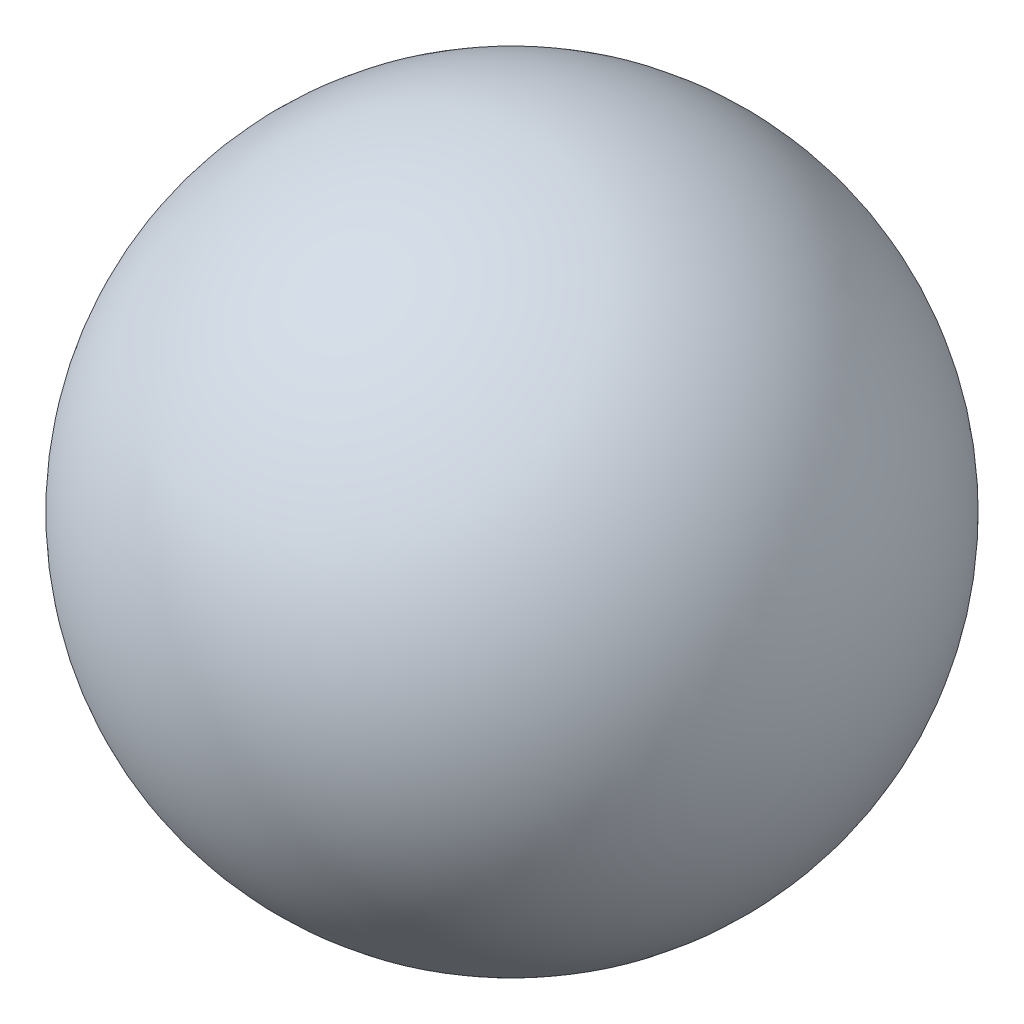
ISO-10303-21;
HEADER;
FILE_DESCRIPTION(('STEP AP214'),'2;1');
FILE_NAME('part.step','',(''),(''),'','','');
FILE_SCHEMA(('AUTOMOTIVE_DESIGN { 1 0 10303 214 1 1 1 1 }'));
ENDSEC;
DATA;
#1=APPLICATION_CONTEXT('core data for automotive mechanical design processes');
#2=APPLICATION_PROTOCOL_DEFINITION('international standard','automotive_design',2000,#1);
#3=PRODUCT_CONTEXT('',#1,'mechanical');
#4=PRODUCT('Part','Part','',(#3));
#5=PRODUCT_RELATED_PRODUCT_CATEGORY('part','',(#4));
#6=PRODUCT_DEFINITION_FORMATION('','',#4);
#7=PRODUCT_DEFINITION_CONTEXT('part definition',#1,'design');
#8=PRODUCT_DEFINITION('design','',#6,#7);
#9=PRODUCT_DEFINITION_SHAPE('','',#8);
#10=(LENGTH_UNIT() NAMED_UNIT(*) SI_UNIT(.MILLI.,.METRE.));
#11=(NAMED_UNIT(*) PLANE_ANGLE_UNIT() SI_UNIT($,.RADIAN.));
#12=(NAMED_UNIT(*) SI_UNIT($,.STERADIAN.) SOLID_ANGLE_UNIT());
#13=UNCERTAINTY_MEASURE_WITH_UNIT(LENGTH_MEASURE(1.E-05),#10,'distance_accuracy_value','');
#14=(GEOMETRIC_REPRESENTATION_CONTEXT(3) GLOBAL_UNCERTAINTY_ASSIGNED_CONTEXT((#13)) GLOBAL_UNIT_ASSIGNED_CONTEXT((#10,
#11,#12)) REPRESENTATION_CONTEXT('',''));
#15=CARTESIAN_POINT('',(0.,0.,0.));
#16=DIRECTION('',(0.,0.,1.));
#17=DIRECTION('',(1.,0.,0.));
#18=AXIS2_PLACEMENT_3D('',#15,#16,#17);
#19=CARTESIAN_POINT('',(0.,156.633333333333,0.));
#20=DIRECTION('',(0.,-1.,0.));
#21=DIRECTION('',(-1.,0.,0.));
#22=AXIS2_PLACEMENT_3D('',#19,#20,#21);
#23=SPHERICAL_SURFACE('',#22,82.55);
#24=CARTESIAN_POINT('',(0.,74.0833333333328,0.));
#25=VERTEX_POINT('',#24);
#26=VERTEX_LOOP('',#25);
#27=FACE_BOUND('',#26,.T.);
#28=ADVANCED_FACE('F38',(#27),#23,.T.);
#29=CLOSED_SHELL('',(#28));
#30=CARTESIAN_POINT('',(0.,156.633333333333,0.));
#31=DIRECTION('',(0.,-1.,0.));
#32=DIRECTION('',(1.,0.,0.));
#33=AXIS2_PLACEMENT_3D('',#30,#31,#32);
#34=SPHERICAL_SURFACE('',#33,76.2);
#35=CARTESIAN_POINT('',(0.,80.4333333333328,0.));
#36=VERTEX_POINT('',#35);
#37=VERTEX_LOOP('',#36);
#38=FACE_BOUND('',#37,.T.);
#39=ADVANCED_FACE('F51',(#38),#34,.F.);
#40=CLOSED_SHELL('',(#39));
#41=ORIENTED_CLOSED_SHELL('',*,#40,.T.);
#42=BREP_WITH_VOIDS('B2',#29,(#41));
#43=ADVANCED_BREP_SHAPE_REPRESENTATION('',(#18,#42),#14);
#44=SHAPE_DEFINITION_REPRESENTATION(#9,#43);
ENDSEC;
END-ISO-10303-21;
